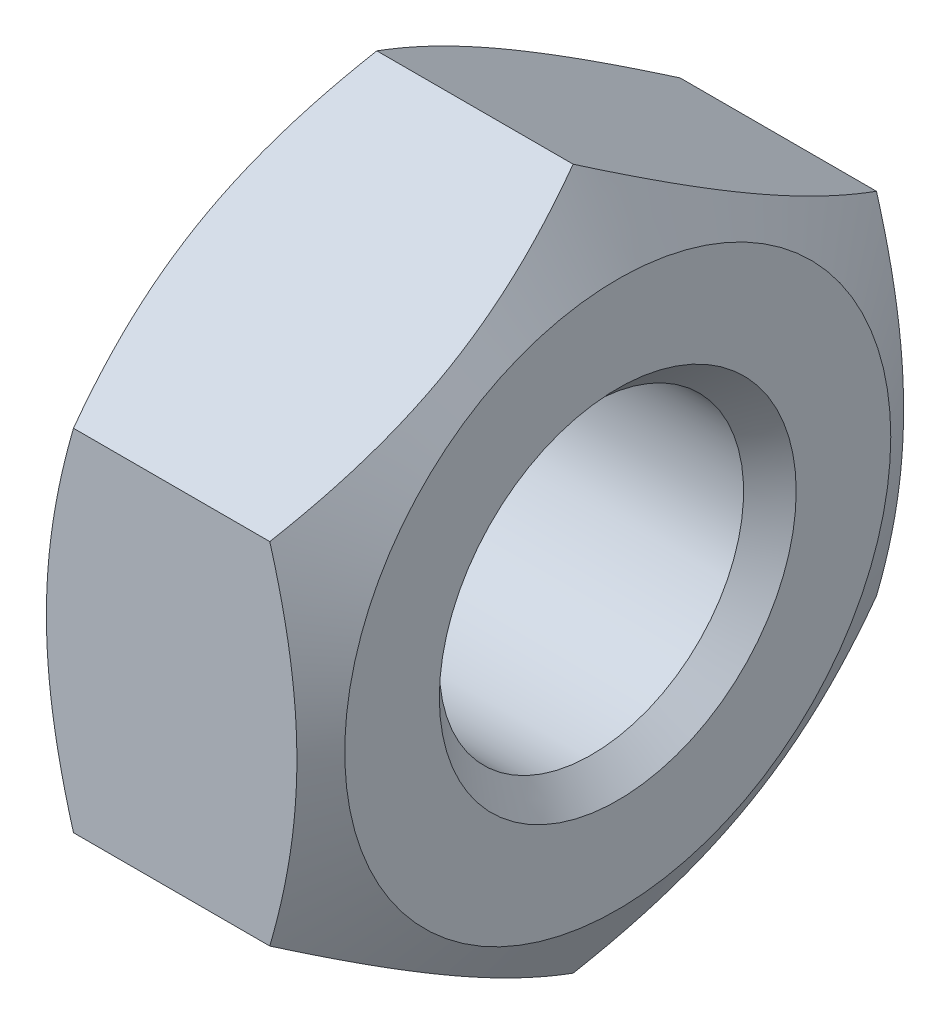
ISO-10303-21;
HEADER;
FILE_DESCRIPTION(('STEP AP214'),'2;1');
FILE_NAME('part.step','',(''),(''),'','','');
FILE_SCHEMA(('AUTOMOTIVE_DESIGN { 1 0 10303 214 1 1 1 1 }'));
ENDSEC;
DATA;
#1=APPLICATION_CONTEXT('core data for automotive mechanical design processes');
#2=APPLICATION_PROTOCOL_DEFINITION('international standard','automotive_design',2000,#1);
#3=PRODUCT_CONTEXT('',#1,'mechanical');
#4=PRODUCT('Part','Part','',(#3));
#5=PRODUCT_RELATED_PRODUCT_CATEGORY('part','',(#4));
#6=PRODUCT_DEFINITION_FORMATION('','',#4);
#7=PRODUCT_DEFINITION_CONTEXT('part definition',#1,'design');
#8=PRODUCT_DEFINITION('design','',#6,#7);
#9=PRODUCT_DEFINITION_SHAPE('','',#8);
#10=(LENGTH_UNIT() NAMED_UNIT(*) SI_UNIT(.MILLI.,.METRE.));
#11=(NAMED_UNIT(*) PLANE_ANGLE_UNIT() SI_UNIT($,.RADIAN.));
#12=(NAMED_UNIT(*) SI_UNIT($,.STERADIAN.) SOLID_ANGLE_UNIT());
#13=UNCERTAINTY_MEASURE_WITH_UNIT(LENGTH_MEASURE(1.E-05),#10,'distance_accuracy_value','');
#14=(GEOMETRIC_REPRESENTATION_CONTEXT(3) GLOBAL_UNCERTAINTY_ASSIGNED_CONTEXT((#13)) GLOBAL_UNIT_ASSIGNED_CONTEXT((#10,
#11,#12)) REPRESENTATION_CONTEXT('',''));
#15=CARTESIAN_POINT('',(0.,0.,0.));
#16=DIRECTION('',(0.,0.,1.));
#17=DIRECTION('',(1.,0.,0.));
#18=AXIS2_PLACEMENT_3D('',#15,#16,#17);
#19=CARTESIAN_POINT('',(0.,0.,0.));
#20=DIRECTION('',(1.,0.,0.));
#21=DIRECTION('',(0.,1.,0.));
#22=AXIS2_PLACEMENT_3D('',#19,#20,#21);
#23=PLANE('',#22);
#24=CARTESIAN_POINT('',(0.,0.,0.));
#25=DIRECTION('',(1.,0.,0.));
#26=DIRECTION('',(0.,0.,-1.));
#27=AXIS2_PLACEMENT_3D('',#24,#25,#26);
#28=CIRCLE('',#27,7.65);
#29=CARTESIAN_POINT('',(0.,0.,7.65));
#30=VERTEX_POINT('',#29);
#31=EDGE_CURVE('E41',#30,#30,#28,.T.);
#32=ORIENTED_EDGE('',*,*,#31,.F.);
#33=EDGE_LOOP('',(#32));
#34=FACE_BOUND('',#33,.T.);
#35=CARTESIAN_POINT('',(0.,0.,0.));
#36=DIRECTION('',(1.,0.,0.));
#37=DIRECTION('',(0.,0.,-1.));
#38=AXIS2_PLACEMENT_3D('',#35,#36,#37);
#39=CIRCLE('',#38,5.);
#40=CARTESIAN_POINT('',(0.,0.,-5.));
#41=VERTEX_POINT('',#40);
#42=EDGE_CURVE('E10',#41,#41,#39,.T.);
#43=ORIENTED_EDGE('',*,*,#42,.T.);
#44=EDGE_LOOP('',(#43));
#45=FACE_BOUND('',#44,.T.);
#46=ADVANCED_FACE('F16',(#34,#45),#23,.F.);
#47=CARTESIAN_POINT('',(0.,0.,0.));
#48=DIRECTION('',(1.,0.,0.));
#49=DIRECTION('',(0.,0.,-1.));
#50=AXIS2_PLACEMENT_3D('',#47,#48,#49);
#51=CONICAL_SURFACE('',#50,7.65,1.0471975511966);
#52=CARTESIAN_POINT('',(1.24993710736787,4.90747728810863,8.50000000000554));
#53=CARTESIAN_POINT('',(-0.166729559302401,7.3612159321684,4.24999999999885));
#54=CARTESIAN_POINT('',(1.24993710736889,9.8149545762286,-8.60311951823248E-12));
#55=(BOUNDED_CURVE() B_SPLINE_CURVE(2,(#52,#53,#54),.UNSPECIFIED.,.F.,
.F.) B_SPLINE_CURVE_WITH_KNOTS((3,3),(-3.14718166720031,-1.35643726516677),
.UNSPECIFIED.) CURVE() GEOMETRIC_REPRESENTATION_ITEM() RATIONAL_B_SPLINE_CURVE((1.70034817503824,
1.96339295314956,1.70034817503808)) REPRESENTATION_ITEM(''));
#56=CARTESIAN_POINT('',(1.24993710736868,4.90747728811758,8.49999999999801));
#57=VERTEX_POINT('',#56);
#58=CARTESIAN_POINT('',(1.24993710736603,9.81495457622364,0.));
#59=VERTEX_POINT('',#58);
#60=EDGE_CURVE('E29',#57,#59,#55,.T.);
#61=ORIENTED_EDGE('',*,*,#60,.T.);
#62=CARTESIAN_POINT('',(1.24993710736889,9.8149545762286,8.60899596599085E-12));
#63=CARTESIAN_POINT('',(-0.166729559302786,7.36121593216773,-4.25));
#64=CARTESIAN_POINT('',(1.24993710736889,4.90747728810685,-8.50000000000861));
#65=(BOUNDED_CURVE() B_SPLINE_CURVE(2,(#62,#63,#64),.UNSPECIFIED.,.F.,
.F.) B_SPLINE_CURVE_WITH_KNOTS((3,3),(-3.14718166720087,-1.35643726516677),
.UNSPECIFIED.) CURVE() GEOMETRIC_REPRESENTATION_ITEM() RATIONAL_B_SPLINE_CURVE((1.70034817503808,
1.96339295314964,1.70034817503808)) REPRESENTATION_ITEM(''));
#66=CARTESIAN_POINT('',(1.24993710736603,4.90747728811182,-8.5));
#67=VERTEX_POINT('',#66);
#68=EDGE_CURVE('E217',#59,#67,#65,.T.);
#69=ORIENTED_EDGE('',*,*,#68,.T.);
#70=CARTESIAN_POINT('',(1.24993710736868,4.90747728812104,-8.5));
#71=CARTESIAN_POINT('',(-0.166729559302632,0.,-8.5));
#72=CARTESIAN_POINT('',(1.24993710736868,-4.90747728812104,-8.5));
#73=(BOUNDED_CURVE() B_SPLINE_CURVE(2,(#70,#71,#72),.UNSPECIFIED.,.F.,
.F.) B_SPLINE_CURVE_WITH_KNOTS((3,3),(-3.1279193957715,-1.345009786714),
.UNSPECIFIED.) CURVE() GEOMETRIC_REPRESENTATION_ITEM() RATIONAL_B_SPLINE_CURVE((1.69345376639804,
1.9554319757811,1.69345376639804)) REPRESENTATION_ITEM(''));
#74=CARTESIAN_POINT('',(1.24993710736603,-4.90747728811182,-8.5));
#75=VERTEX_POINT('',#74);
#76=EDGE_CURVE('E231',#67,#75,#73,.T.);
#77=ORIENTED_EDGE('',*,*,#76,.T.);
#78=CARTESIAN_POINT('',(1.2499371073689,-4.90747728810685,-8.50000000000862));
#79=CARTESIAN_POINT('',(-0.166729559302785,-7.36121593216773,-4.25000000000001));
#80=CARTESIAN_POINT('',(1.24993710736889,-9.8149545762286,8.60311951823248E-12));
#81=(BOUNDED_CURVE() B_SPLINE_CURVE(2,(#78,#79,#80),.UNSPECIFIED.,.F.,
.F.) B_SPLINE_CURVE_WITH_KNOTS((3,3),(-3.14718166720087,-1.35643726516677),
.UNSPECIFIED.) CURVE() GEOMETRIC_REPRESENTATION_ITEM() RATIONAL_B_SPLINE_CURVE((1.70034817503808,
1.96339295314964,1.70034817503808)) REPRESENTATION_ITEM(''));
#82=CARTESIAN_POINT('',(1.24993710736603,-9.81495457622364,0.));
#83=VERTEX_POINT('',#82);
#84=EDGE_CURVE('E240',#75,#83,#81,.T.);
#85=ORIENTED_EDGE('',*,*,#84,.T.);
#86=CARTESIAN_POINT('',(1.24993710736889,-9.8149545762286,-8.60899596599085E-12));
#87=CARTESIAN_POINT('',(-0.166729559302814,-7.36121593216768,4.25000000000009));
#88=CARTESIAN_POINT('',(1.24993710736897,-4.90747728810672,8.50000000000884));
#89=(BOUNDED_CURVE() B_SPLINE_CURVE(2,(#86,#87,#88),.UNSPECIFIED.,.F.,
.F.) B_SPLINE_CURVE_WITH_KNOTS((3,3),(-3.14718166720087,-1.35643726516673),
.UNSPECIFIED.) CURVE() GEOMETRIC_REPRESENTATION_ITEM() RATIONAL_B_SPLINE_CURVE((1.70034817503808,
1.96339295314964,1.70034817503806)) REPRESENTATION_ITEM(''));
#90=CARTESIAN_POINT('',(1.24993710736616,-4.90747728811182,8.50000000000028));
#91=VERTEX_POINT('',#90);
#92=EDGE_CURVE('E63',#83,#91,#89,.T.);
#93=ORIENTED_EDGE('',*,*,#92,.T.);
#94=CARTESIAN_POINT('',(1.24993710736868,-4.90747728812104,8.5));
#95=CARTESIAN_POINT('',(0.49074772881118,-2.27756813566825,8.5));
#96=CARTESIAN_POINT('',(0.49074772881118,0.,8.5));
#97=(BOUNDED_CURVE() B_SPLINE_CURVE(2,(#94,#95,#96),.UNSPECIFIED.,.F.,
.F.) B_SPLINE_CURVE_WITH_KNOTS((3,3),(-3.1279193957715,-2.23646459124275),
.UNSPECIFIED.) CURVE() GEOMETRIC_REPRESENTATION_ITEM() RATIONAL_B_SPLINE_CURVE((1.69345376639804,
1.82444287108957,1.82444287108957)) REPRESENTATION_ITEM(''));
#98=CARTESIAN_POINT('',(0.49074772881118,0.,8.5));
#99=VERTEX_POINT('',#98);
#100=EDGE_CURVE('E76',#91,#99,#97,.T.);
#101=ORIENTED_EDGE('',*,*,#100,.T.);
#102=DIRECTION('',(-0.5,0.,-0.86602540378444));
#103=VECTOR('',#102,1.);
#104=CARTESIAN_POINT('',(0.,0.,7.65));
#105=LINE('',#104,#103);
#106=EDGE_CURVE('E186',#99,#30,#105,.T.);
#107=ORIENTED_EDGE('',*,*,#106,.T.);
#108=ORIENTED_EDGE('',*,*,#31,.T.);
#109=ORIENTED_EDGE('',*,*,#106,.F.);
#110=CARTESIAN_POINT('',(0.49074772881118,0.,8.5));
#111=CARTESIAN_POINT('',(0.49074772881118,2.27756813566825,8.5));
#112=CARTESIAN_POINT('',(1.24993710736868,4.90747728812104,8.5));
#113=(BOUNDED_CURVE() B_SPLINE_CURVE(2,(#110,#111,#112),.UNSPECIFIED.,.F.,
.F.) B_SPLINE_CURVE_WITH_KNOTS((3,3),(-2.23646459124275,-1.345009786714),
.UNSPECIFIED.) CURVE() GEOMETRIC_REPRESENTATION_ITEM() RATIONAL_B_SPLINE_CURVE((1.82444287108957,
1.82444287108957,1.69345376639804)) REPRESENTATION_ITEM(''));
#114=EDGE_CURVE('E261',#99,#57,#113,.T.);
#115=ORIENTED_EDGE('',*,*,#114,.T.);
#116=EDGE_LOOP('',(#61,#69,#77,#85,#93,#101,#107,#108,#109,#115));
#117=FACE_BOUND('',#116,.T.);
#118=ADVANCED_FACE('F352',(#117),#51,.T.);
#119=CARTESIAN_POINT('',(6.52775681356645,0.,0.));
#120=DIRECTION('',(-1.,0.,0.));
#121=DIRECTION('',(0.,0.,1.));
#122=AXIS2_PLACEMENT_3D('',#119,#120,#121);
#123=CONICAL_SURFACE('',#122,10.2,1.0471975511966);
#124=CARTESIAN_POINT('',(6.75006289262923,9.81495457623183,-1.4169411616725E-11));
#125=CARTESIAN_POINT('',(8.16672955930418,7.36121593216768,4.25000000000008));
#126=CARTESIAN_POINT('',(6.75006289262916,4.90747728810352,8.50000000001438));
#127=(BOUNDED_CURVE() B_SPLINE_CURVE(2,(#124,#125,#126),.UNSPECIFIED.,.F.,
.F.) B_SPLINE_CURVE_WITH_KNOTS((3,3),(-3.28197856606582,-1.4362997029782),
.UNSPECIFIED.) CURVE() GEOMETRIC_REPRESENTATION_ITEM() RATIONAL_B_SPLINE_CURVE((1.74869346263732,
2.01921728276928,1.7486934626373)) REPRESENTATION_ITEM(''));
#128=CARTESIAN_POINT('',(6.75006289263397,9.81495457622364,0.));
#129=VERTEX_POINT('',#128);
#130=CARTESIAN_POINT('',(6.75006289263382,4.90747728811182,8.50000000000028));
#131=VERTEX_POINT('',#130);
#132=EDGE_CURVE('E20',#129,#131,#127,.T.);
#133=ORIENTED_EDGE('',*,*,#132,.T.);
#134=CARTESIAN_POINT('',(6.75006289262925,4.90747728812815,8.49999999999999));
#135=CARTESIAN_POINT('',(8.16672955930416,0.,8.50000000000001));
#136=CARTESIAN_POINT('',(6.75006289262925,-4.90747728812816,8.49999999999999));
#137=(BOUNDED_CURVE() B_SPLINE_CURVE(2,(#134,#135,#136),.UNSPECIFIED.,.F.,
.F.) B_SPLINE_CURVE_WITH_KNOTS((3,3),(-3.28197856606577,-1.43629970297822),
.UNSPECIFIED.) CURVE() GEOMETRIC_REPRESENTATION_ITEM() RATIONAL_B_SPLINE_CURVE((1.7486934626373,
2.01921728276925,1.7486934626373)) REPRESENTATION_ITEM(''));
#138=CARTESIAN_POINT('',(6.75006289263382,-4.90747728811182,8.50000000000028));
#139=VERTEX_POINT('',#138);
#140=EDGE_CURVE('E139',#131,#139,#137,.T.);
#141=ORIENTED_EDGE('',*,*,#140,.T.);
#142=CARTESIAN_POINT('',(6.75006289262916,-4.90747728810352,8.50000000001438));
#143=CARTESIAN_POINT('',(8.16672955930418,-7.36121593216768,4.25000000000009));
#144=CARTESIAN_POINT('',(6.75006289262925,-9.8149545762318,-1.41471905661566E-11));
#145=(BOUNDED_CURVE() B_SPLINE_CURVE(2,(#142,#143,#144),.UNSPECIFIED.,.F.,
.F.) B_SPLINE_CURVE_WITH_KNOTS((3,3),(-3.28197856606586,-1.43629970297824),
.UNSPECIFIED.) CURVE() GEOMETRIC_REPRESENTATION_ITEM() RATIONAL_B_SPLINE_CURVE((1.7486934626373,
2.01921728276928,1.74869346263732)) REPRESENTATION_ITEM(''));
#146=CARTESIAN_POINT('',(6.75006289263397,-9.81495457622364,0.));
#147=VERTEX_POINT('',#146);
#148=EDGE_CURVE('E145',#139,#147,#145,.T.);
#149=ORIENTED_EDGE('',*,*,#148,.T.);
#150=CARTESIAN_POINT('',(6.75006289262923,-9.8149545762318,1.41602057529181E-11));
#151=CARTESIAN_POINT('',(8.16672955930417,-7.36121593216773,-4.24999999999999));
#152=CARTESIAN_POINT('',(6.75006289262925,-4.90747728810366,-8.50000000001414));
#153=(BOUNDED_CURVE() B_SPLINE_CURVE(2,(#150,#151,#152),.UNSPECIFIED.,.F.,
.F.) B_SPLINE_CURVE_WITH_KNOTS((3,3),(-3.28197856606582,-1.43629970297824),
.UNSPECIFIED.) CURVE() GEOMETRIC_REPRESENTATION_ITEM() RATIONAL_B_SPLINE_CURVE((1.74869346263732,
2.01921728276927,1.74869346263732)) REPRESENTATION_ITEM(''));
#154=CARTESIAN_POINT('',(6.75006289263397,-4.90747728811182,-8.5));
#155=VERTEX_POINT('',#154);
#156=EDGE_CURVE('E152',#147,#155,#153,.T.);
#157=ORIENTED_EDGE('',*,*,#156,.T.);
#158=CARTESIAN_POINT('',(6.75006289262925,-4.90747728812815,-8.49999999999999));
#159=CARTESIAN_POINT('',(7.50925227118881,-2.27756813567111,-8.50000000000001));
#160=CARTESIAN_POINT('',(7.50925227118881,0.,-8.50000000000001));
#161=(BOUNDED_CURVE() B_SPLINE_CURVE(2,(#158,#159,#160),.UNSPECIFIED.,.F.,
.F.) B_SPLINE_CURVE_WITH_KNOTS((3,3),(-3.28197856606577,-2.359139134522),
.UNSPECIFIED.) CURVE() GEOMETRIC_REPRESENTATION_ITEM() RATIONAL_B_SPLINE_CURVE((1.7486934626373,
1.88395537270328,1.88395537270328)) REPRESENTATION_ITEM(''));
#162=CARTESIAN_POINT('',(7.50925227118881,0.,-8.5));
#163=VERTEX_POINT('',#162);
#164=EDGE_CURVE('E159',#155,#163,#161,.T.);
#165=ORIENTED_EDGE('',*,*,#164,.T.);
#166=DIRECTION('',(0.5,0.,0.86602540378444));
#167=VECTOR('',#166,1.);
#168=CARTESIAN_POINT('',(6.52775681356645,0.,-10.2));
#169=LINE('',#168,#167);
#170=CARTESIAN_POINT('',(8.,0.,-7.65));
#171=VERTEX_POINT('',#170);
#172=EDGE_CURVE('E194',#163,#171,#169,.T.);
#173=ORIENTED_EDGE('',*,*,#172,.T.);
#174=CARTESIAN_POINT('',(8.,0.,0.));
#175=DIRECTION('',(1.,0.,0.));
#176=DIRECTION('',(0.,0.,-1.));
#177=AXIS2_PLACEMENT_3D('',#174,#175,#176);
#178=CIRCLE('',#177,7.65);
#179=EDGE_CURVE('E115',#171,#171,#178,.T.);
#180=ORIENTED_EDGE('',*,*,#179,.F.);
#181=ORIENTED_EDGE('',*,*,#172,.F.);
#182=CARTESIAN_POINT('',(7.50925227118881,0.,-8.50000000000001));
#183=CARTESIAN_POINT('',(7.50925227118881,2.27756813567111,-8.50000000000001));
#184=CARTESIAN_POINT('',(6.75006289262925,4.90747728812816,-8.49999999999999));
#185=(BOUNDED_CURVE() B_SPLINE_CURVE(2,(#182,#183,#184),.UNSPECIFIED.,.F.,
.F.) B_SPLINE_CURVE_WITH_KNOTS((3,3),(-2.359139134522,-1.43629970297822),
.UNSPECIFIED.) CURVE() GEOMETRIC_REPRESENTATION_ITEM() RATIONAL_B_SPLINE_CURVE((1.88395537270328,
1.88395537270328,1.7486934626373)) REPRESENTATION_ITEM(''));
#186=CARTESIAN_POINT('',(6.75006289263397,4.90747728811182,-8.5));
#187=VERTEX_POINT('',#186);
#188=EDGE_CURVE('E187',#163,#187,#185,.T.);
#189=ORIENTED_EDGE('',*,*,#188,.T.);
#190=CARTESIAN_POINT('',(6.75006289262925,4.90747728810365,-8.50000000001416));
#191=CARTESIAN_POINT('',(8.16672955930417,7.36121593216773,-4.25));
#192=CARTESIAN_POINT('',(6.75006289262925,9.8149545762318,1.41471905661566E-11));
#193=(BOUNDED_CURVE() B_SPLINE_CURVE(2,(#190,#191,#192),.UNSPECIFIED.,.F.,
.F.) B_SPLINE_CURVE_WITH_KNOTS((3,3),(-3.28197856606582,-1.43629970297824),
.UNSPECIFIED.) CURVE() GEOMETRIC_REPRESENTATION_ITEM() RATIONAL_B_SPLINE_CURVE((1.74869346263732,
2.01921728276927,1.74869346263732)) REPRESENTATION_ITEM(''));
#194=EDGE_CURVE('E102',#187,#129,#193,.T.);
#195=ORIENTED_EDGE('',*,*,#194,.T.);
#196=EDGE_LOOP('',(#133,#141,#149,#157,#165,#173,#180,#181,#189,#195));
#197=FACE_BOUND('',#196,.T.);
#198=ADVANCED_FACE('F18',(#197),#123,.T.);
#199=CARTESIAN_POINT('',(8.,7.65,0.));
#200=DIRECTION('',(-1.,0.,0.));
#201=DIRECTION('',(0.,0.,1.));
#202=AXIS2_PLACEMENT_3D('',#199,#200,#201);
#203=PLANE('',#202);
#204=ORIENTED_EDGE('',*,*,#179,.T.);
#205=EDGE_LOOP('',(#204));
#206=FACE_BOUND('',#205,.T.);
#207=CARTESIAN_POINT('',(8.,0.,0.));
#208=DIRECTION('',(1.,0.,0.));
#209=DIRECTION('',(0.,0.,-1.));
#210=AXIS2_PLACEMENT_3D('',#207,#208,#209);
#211=CIRCLE('',#210,5.);
#212=CARTESIAN_POINT('',(8.,0.,5.));
#213=VERTEX_POINT('',#212);
#214=EDGE_CURVE('E182',#213,#213,#211,.T.);
#215=ORIENTED_EDGE('',*,*,#214,.F.);
#216=EDGE_LOOP('',(#215));
#217=FACE_BOUND('',#216,.T.);
#218=ADVANCED_FACE('F341',(#206,#217),#203,.F.);
#219=CARTESIAN_POINT('',(0.,0.,0.));
#220=DIRECTION('',(-1.,0.,0.));
#221=DIRECTION('',(0.,0.,1.));
#222=AXIS2_PLACEMENT_3D('',#219,#220,#221);
#223=CONICAL_SURFACE('',#222,5.,0.785398163397448);
#224=CARTESIAN_POINT('',(0.737,0.,0.));
#225=DIRECTION('',(1.,0.,0.));
#226=DIRECTION('',(0.,0.,-1.));
#227=AXIS2_PLACEMENT_3D('',#224,#225,#226);
#228=CIRCLE('',#227,4.263);
#229=CARTESIAN_POINT('',(0.737,0.,4.263));
#230=VERTEX_POINT('',#229);
#231=CARTESIAN_POINT('',(0.737,0.,-4.263));
#232=VERTEX_POINT('',#231);
#233=EDGE_CURVE('E211',#230,#232,#228,.T.);
#234=ORIENTED_EDGE('',*,*,#233,.T.);
#235=DIRECTION('',(-0.707106781186548,0.,-0.707106781186547));
#236=VECTOR('',#235,1.);
#237=CARTESIAN_POINT('',(0.,0.,-5.));
#238=LINE('',#237,#236);
#239=EDGE_CURVE('E241',#232,#41,#238,.T.);
#240=ORIENTED_EDGE('',*,*,#239,.T.);
#241=ORIENTED_EDGE('',*,*,#42,.F.);
#242=ORIENTED_EDGE('',*,*,#239,.F.);
#243=CARTESIAN_POINT('',(0.737,0.,0.));
#244=DIRECTION('',(1.,0.,0.));
#245=DIRECTION('',(0.,0.,-1.));
#246=AXIS2_PLACEMENT_3D('',#243,#244,#245);
#247=CIRCLE('',#246,4.263);
#248=EDGE_CURVE('E247',#232,#230,#247,.T.);
#249=ORIENTED_EDGE('',*,*,#248,.T.);
#250=EDGE_LOOP('',(#234,#240,#241,#242,#249));
#251=FACE_BOUND('',#250,.T.);
#252=ADVANCED_FACE('F330',(#251),#223,.F.);
#253=CARTESIAN_POINT('',(8.,0.,0.));
#254=DIRECTION('',(1.,0.,0.));
#255=DIRECTION('',(0.,0.,-1.));
#256=AXIS2_PLACEMENT_3D('',#253,#254,#255);
#257=CYLINDRICAL_SURFACE('',#256,4.263);
#258=ORIENTED_EDGE('',*,*,#233,.F.);
#259=DIRECTION('',(1.,0.,0.));
#260=VECTOR('',#259,1.);
#261=CARTESIAN_POINT('',(8.,0.,4.263));
#262=LINE('',#261,#260);
#263=CARTESIAN_POINT('',(7.263,0.,4.263));
#264=VERTEX_POINT('',#263);
#265=EDGE_CURVE('E285',#230,#264,#262,.T.);
#266=ORIENTED_EDGE('',*,*,#265,.T.);
#267=CARTESIAN_POINT('',(7.263,0.,0.));
#268=DIRECTION('',(1.,0.,0.));
#269=DIRECTION('',(0.,0.,-1.));
#270=AXIS2_PLACEMENT_3D('',#267,#268,#269);
#271=CIRCLE('',#270,4.263);
#272=EDGE_CURVE('E181',#264,#264,#271,.T.);
#273=ORIENTED_EDGE('',*,*,#272,.T.);
#274=ORIENTED_EDGE('',*,*,#265,.F.);
#275=ORIENTED_EDGE('',*,*,#248,.F.);
#276=EDGE_LOOP('',(#258,#266,#273,#274,#275));
#277=FACE_BOUND('',#276,.T.);
#278=ADVANCED_FACE('F333',(#277),#257,.F.);
#279=CARTESIAN_POINT('',(7.188,0.,0.));
#280=DIRECTION('',(1.,0.,0.));
#281=DIRECTION('',(0.,0.,-1.));
#282=AXIS2_PLACEMENT_3D('',#279,#280,#281);
#283=CONICAL_SURFACE('',#282,4.188,0.785398163397448);
#284=ORIENTED_EDGE('',*,*,#272,.F.);
#285=DIRECTION('',(0.707106781186548,0.,0.707106781186547));
#286=VECTOR('',#285,1.);
#287=CARTESIAN_POINT('',(7.188,0.,4.188));
#288=LINE('',#287,#286);
#289=EDGE_CURVE('E178',#264,#213,#288,.T.);
#290=ORIENTED_EDGE('',*,*,#289,.T.);
#291=ORIENTED_EDGE('',*,*,#214,.T.);
#292=ORIENTED_EDGE('',*,*,#289,.F.);
#293=EDGE_LOOP('',(#284,#290,#291,#292));
#294=FACE_BOUND('',#293,.T.);
#295=ADVANCED_FACE('F336',(#294),#283,.F.);
#296=CARTESIAN_POINT('',(7.4,4.90747728811182,8.50000000000028));
#297=DIRECTION('',(0.,0.,-1.));
#298=DIRECTION('',(0.,-1.,0.));
#299=AXIS2_PLACEMENT_3D('',#296,#297,#298);
#300=PLANE('',#299);
#301=DIRECTION('',(-1.,0.,0.));
#302=VECTOR('',#301,1.);
#303=CARTESIAN_POINT('',(7.4,-4.90747728811182,8.50000000000028));
#304=LINE('',#303,#302);
#305=EDGE_CURVE('E165',#139,#91,#304,.T.);
#306=ORIENTED_EDGE('',*,*,#305,.F.);
#307=ORIENTED_EDGE('',*,*,#140,.F.);
#308=DIRECTION('',(-1.,0.,0.));
#309=VECTOR('',#308,1.);
#310=CARTESIAN_POINT('',(7.4,4.90747728811182,8.50000000000028));
#311=LINE('',#310,#309);
#312=EDGE_CURVE('E225',#131,#57,#311,.T.);
#313=ORIENTED_EDGE('',*,*,#312,.T.);
#314=ORIENTED_EDGE('',*,*,#114,.F.);
#315=ORIENTED_EDGE('',*,*,#100,.F.);
#316=EDGE_LOOP('',(#306,#307,#313,#314,#315));
#317=FACE_BOUND('',#316,.T.);
#318=ADVANCED_FACE('F364',(#317),#300,.F.);
#319=CARTESIAN_POINT('',(9.,9.81495457622364,0.));
#320=DIRECTION('',(0.,-0.866025403784439,-0.5));
#321=DIRECTION('',(0.,0.5,-0.866025403784439));
#322=AXIS2_PLACEMENT_3D('',#319,#320,#321);
#323=PLANE('',#322);
#324=ORIENTED_EDGE('',*,*,#312,.F.);
#325=ORIENTED_EDGE('',*,*,#132,.F.);
#326=DIRECTION('',(-1.,0.,0.));
#327=VECTOR('',#326,1.);
#328=CARTESIAN_POINT('',(9.,9.81495457622364,0.));
#329=LINE('',#328,#327);
#330=EDGE_CURVE('E249',#129,#59,#329,.T.);
#331=ORIENTED_EDGE('',*,*,#330,.T.);
#332=ORIENTED_EDGE('',*,*,#60,.F.);
#333=EDGE_LOOP('',(#324,#325,#331,#332));
#334=FACE_BOUND('',#333,.T.);
#335=ADVANCED_FACE('F366',(#334),#323,.F.);
#336=CARTESIAN_POINT('',(9.,4.90747728811182,-8.5));
#337=DIRECTION('',(0.,-0.866025403784439,0.5));
#338=DIRECTION('',(-1.,0.,0.));
#339=AXIS2_PLACEMENT_3D('',#336,#337,#338);
#340=PLANE('',#339);
#341=ORIENTED_EDGE('',*,*,#330,.F.);
#342=ORIENTED_EDGE('',*,*,#194,.F.);
#343=DIRECTION('',(-1.,0.,0.));
#344=VECTOR('',#343,1.);
#345=CARTESIAN_POINT('',(9.,4.90747728811182,-8.5));
#346=LINE('',#345,#344);
#347=EDGE_CURVE('E171',#187,#67,#346,.T.);
#348=ORIENTED_EDGE('',*,*,#347,.T.);
#349=ORIENTED_EDGE('',*,*,#68,.F.);
#350=EDGE_LOOP('',(#341,#342,#348,#349));
#351=FACE_BOUND('',#350,.T.);
#352=ADVANCED_FACE('F372',(#351),#340,.F.);
#353=CARTESIAN_POINT('',(9.,-4.90747728811182,-8.5));
#354=DIRECTION('',(0.,0.,1.));
#355=DIRECTION('',(1.,0.,0.));
#356=AXIS2_PLACEMENT_3D('',#353,#354,#355);
#357=PLANE('',#356);
#358=ORIENTED_EDGE('',*,*,#347,.F.);
#359=ORIENTED_EDGE('',*,*,#188,.F.);
#360=ORIENTED_EDGE('',*,*,#164,.F.);
#361=DIRECTION('',(-1.,0.,0.));
#362=VECTOR('',#361,1.);
#363=CARTESIAN_POINT('',(9.,-4.90747728811182,-8.5));
#364=LINE('',#363,#362);
#365=EDGE_CURVE('E156',#155,#75,#364,.T.);
#366=ORIENTED_EDGE('',*,*,#365,.T.);
#367=ORIENTED_EDGE('',*,*,#76,.F.);
#368=EDGE_LOOP('',(#358,#359,#360,#366,#367));
#369=FACE_BOUND('',#368,.T.);
#370=ADVANCED_FACE('F380',(#369),#357,.F.);
#371=CARTESIAN_POINT('',(9.,-9.81495457622364,0.));
#372=DIRECTION('',(0.,0.866025403784439,0.5));
#373=DIRECTION('',(1.,0.,0.));
#374=AXIS2_PLACEMENT_3D('',#371,#372,#373);
#375=PLANE('',#374);
#376=ORIENTED_EDGE('',*,*,#365,.F.);
#377=ORIENTED_EDGE('',*,*,#156,.F.);
#378=DIRECTION('',(-1.,0.,0.));
#379=VECTOR('',#378,1.);
#380=CARTESIAN_POINT('',(9.,-9.81495457622364,0.));
#381=LINE('',#380,#379);
#382=EDGE_CURVE('E154',#147,#83,#381,.T.);
#383=ORIENTED_EDGE('',*,*,#382,.T.);
#384=ORIENTED_EDGE('',*,*,#84,.F.);
#385=EDGE_LOOP('',(#376,#377,#383,#384));
#386=FACE_BOUND('',#385,.T.);
#387=ADVANCED_FACE('F153',(#386),#375,.F.);
#388=CARTESIAN_POINT('',(9.,-4.90747728811182,8.5));
#389=DIRECTION('',(0.,0.866025403784439,-0.5));
#390=DIRECTION('',(-1.,0.,0.));
#391=AXIS2_PLACEMENT_3D('',#388,#389,#390);
#392=PLANE('',#391);
#393=ORIENTED_EDGE('',*,*,#382,.F.);
#394=ORIENTED_EDGE('',*,*,#148,.F.);
#395=ORIENTED_EDGE('',*,*,#305,.T.);
#396=ORIENTED_EDGE('',*,*,#92,.F.);
#397=EDGE_LOOP('',(#393,#394,#395,#396));
#398=FACE_BOUND('',#397,.T.);
#399=ADVANCED_FACE('F163',(#398),#392,.F.);
#400=CLOSED_SHELL('',(#46,#118,#198,#218,#252,#278,#295,#318,#335,#352,#370,#387,#399));
#401=MANIFOLD_SOLID_BREP('B1',#400);
#402=ADVANCED_BREP_SHAPE_REPRESENTATION('',(#18,#401),#14);
#403=SHAPE_DEFINITION_REPRESENTATION(#9,#402);
ENDSEC;
END-ISO-10303-21;
